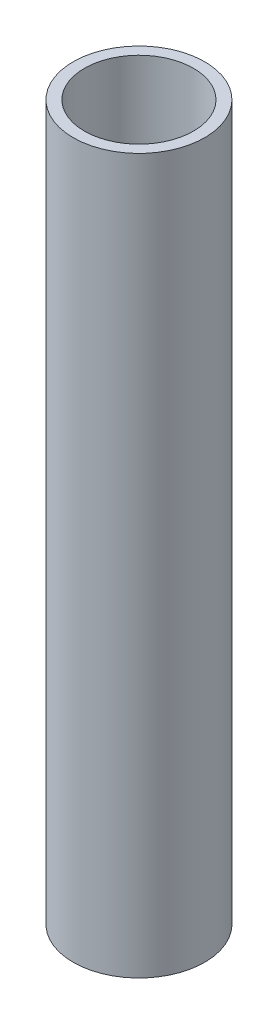
ISO-10303-21;
HEADER;
FILE_DESCRIPTION(('STEP AP214'),'2;1');
FILE_NAME('part.step','',(''),(''),'','','');
FILE_SCHEMA(('AUTOMOTIVE_DESIGN { 1 0 10303 214 1 1 1 1 }'));
ENDSEC;
DATA;
#1=APPLICATION_CONTEXT('core data for automotive mechanical design processes');
#2=APPLICATION_PROTOCOL_DEFINITION('international standard','automotive_design',2000,#1);
#3=PRODUCT_CONTEXT('',#1,'mechanical');
#4=PRODUCT('Part','Part','',(#3));
#5=PRODUCT_RELATED_PRODUCT_CATEGORY('part','',(#4));
#6=PRODUCT_DEFINITION_FORMATION('','',#4);
#7=PRODUCT_DEFINITION_CONTEXT('part definition',#1,'design');
#8=PRODUCT_DEFINITION('design','',#6,#7);
#9=PRODUCT_DEFINITION_SHAPE('','',#8);
#10=(LENGTH_UNIT() NAMED_UNIT(*) SI_UNIT(.MILLI.,.METRE.));
#11=(NAMED_UNIT(*) PLANE_ANGLE_UNIT() SI_UNIT($,.RADIAN.));
#12=(NAMED_UNIT(*) SI_UNIT($,.STERADIAN.) SOLID_ANGLE_UNIT());
#13=UNCERTAINTY_MEASURE_WITH_UNIT(LENGTH_MEASURE(1.E-05),#10,'distance_accuracy_value','');
#14=(GEOMETRIC_REPRESENTATION_CONTEXT(3) GLOBAL_UNCERTAINTY_ASSIGNED_CONTEXT((#13)) GLOBAL_UNIT_ASSIGNED_CONTEXT((#10,
#11,#12)) REPRESENTATION_CONTEXT('',''));
#15=CARTESIAN_POINT('',(0.,0.,0.));
#16=DIRECTION('',(0.,0.,1.));
#17=DIRECTION('',(1.,0.,0.));
#18=AXIS2_PLACEMENT_3D('',#15,#16,#17);
#19=CARTESIAN_POINT('',(40.,-130.,0.));
#20=DIRECTION('',(0.,1.,0.));
#21=DIRECTION('',(0.,0.,1.));
#22=AXIS2_PLACEMENT_3D('',#19,#20,#21);
#23=CYLINDRICAL_SURFACE('',#22,17.5);
#24=CARTESIAN_POINT('',(40.,-130.,0.));
#25=DIRECTION('',(0.,1.,0.));
#26=DIRECTION('',(0.,0.,1.));
#27=AXIS2_PLACEMENT_3D('',#24,#25,#26);
#28=CIRCLE('',#27,17.5);
#29=CARTESIAN_POINT('',(40.,-130.,17.5));
#30=VERTEX_POINT('',#29);
#31=EDGE_CURVE('E55',#30,#30,#28,.T.);
#32=ORIENTED_EDGE('',*,*,#31,.T.);
#33=EDGE_LOOP('',(#32));
#34=FACE_BOUND('',#33,.T.);
#35=CARTESIAN_POINT('',(40.,60.,0.));
#36=DIRECTION('',(0.,1.,0.));
#37=DIRECTION('',(0.,0.,1.));
#38=AXIS2_PLACEMENT_3D('',#35,#36,#37);
#39=CIRCLE('',#38,17.5);
#40=CARTESIAN_POINT('',(40.,60.,17.5));
#41=VERTEX_POINT('',#40);
#42=EDGE_CURVE('E47',#41,#41,#39,.T.);
#43=ORIENTED_EDGE('',*,*,#42,.F.);
#44=EDGE_LOOP('',(#43));
#45=FACE_BOUND('',#44,.T.);
#46=ADVANCED_FACE('F41',(#34,#45),#23,.T.);
#47=CARTESIAN_POINT('',(40.,-130.,0.));
#48=DIRECTION('',(0.,1.,0.));
#49=DIRECTION('',(0.,0.,1.));
#50=AXIS2_PLACEMENT_3D('',#47,#48,#49);
#51=CYLINDRICAL_SURFACE('',#50,14.5);
#52=CARTESIAN_POINT('',(40.,-130.,0.));
#53=DIRECTION('',(0.,1.,0.));
#54=DIRECTION('',(0.,0.,1.));
#55=AXIS2_PLACEMENT_3D('',#52,#53,#54);
#56=CIRCLE('',#55,14.5);
#57=CARTESIAN_POINT('',(40.,-130.,14.5));
#58=VERTEX_POINT('',#57);
#59=EDGE_CURVE('E51',#58,#58,#56,.T.);
#60=ORIENTED_EDGE('',*,*,#59,.F.);
#61=EDGE_LOOP('',(#60));
#62=FACE_BOUND('',#61,.T.);
#63=CARTESIAN_POINT('',(40.,60.,0.));
#64=DIRECTION('',(0.,1.,0.));
#65=DIRECTION('',(0.,0.,1.));
#66=AXIS2_PLACEMENT_3D('',#63,#64,#65);
#67=CIRCLE('',#66,14.5);
#68=CARTESIAN_POINT('',(40.,60.,14.5));
#69=VERTEX_POINT('',#68);
#70=EDGE_CURVE('E10',#69,#69,#67,.T.);
#71=ORIENTED_EDGE('',*,*,#70,.T.);
#72=EDGE_LOOP('',(#71));
#73=FACE_BOUND('',#72,.T.);
#74=ADVANCED_FACE('F72',(#62,#73),#51,.F.);
#75=CARTESIAN_POINT('',(40.,60.,0.));
#76=DIRECTION('',(0.,1.,0.));
#77=DIRECTION('',(0.,0.,1.));
#78=AXIS2_PLACEMENT_3D('',#75,#76,#77);
#79=PLANE('',#78);
#80=ORIENTED_EDGE('',*,*,#42,.T.);
#81=EDGE_LOOP('',(#80));
#82=FACE_BOUND('',#81,.T.);
#83=ORIENTED_EDGE('',*,*,#70,.F.);
#84=EDGE_LOOP('',(#83));
#85=FACE_BOUND('',#84,.T.);
#86=ADVANCED_FACE('F65',(#82,#85),#79,.T.);
#87=CARTESIAN_POINT('',(40.,-130.,0.));
#88=DIRECTION('',(0.,1.,0.));
#89=DIRECTION('',(0.,0.,1.));
#90=AXIS2_PLACEMENT_3D('',#87,#88,#89);
#91=PLANE('',#90);
#92=ORIENTED_EDGE('',*,*,#59,.T.);
#93=EDGE_LOOP('',(#92));
#94=FACE_BOUND('',#93,.T.);
#95=ORIENTED_EDGE('',*,*,#31,.F.);
#96=EDGE_LOOP('',(#95));
#97=FACE_BOUND('',#96,.T.);
#98=ADVANCED_FACE('F63',(#94,#97),#91,.F.);
#99=CLOSED_SHELL('',(#46,#74,#86,#98));
#100=MANIFOLD_SOLID_BREP('B2',#99);
#101=ADVANCED_BREP_SHAPE_REPRESENTATION('',(#18,#100),#14);
#102=SHAPE_DEFINITION_REPRESENTATION(#9,#101);
ENDSEC;
END-ISO-10303-21;
